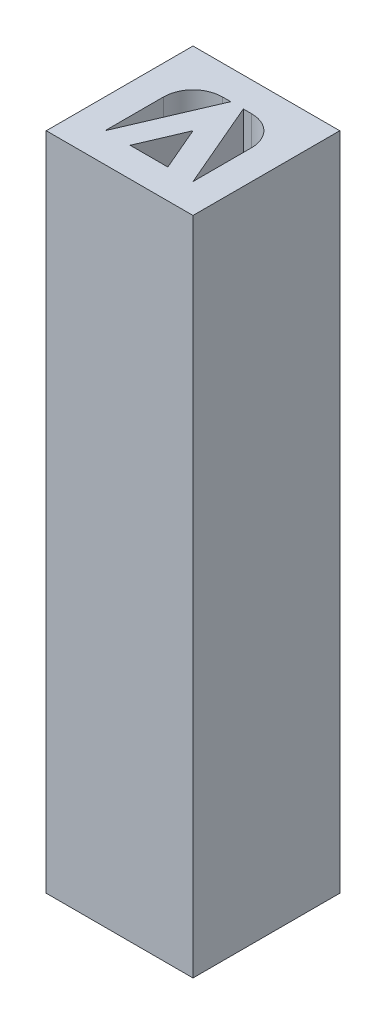
ISO-10303-21;
HEADER;
FILE_DESCRIPTION(('STEP AP214'),'2;1');
FILE_NAME('part.step','',(''),(''),'','','');
FILE_SCHEMA(('AUTOMOTIVE_DESIGN { 1 0 10303 214 1 1 1 1 }'));
ENDSEC;
DATA;
#1=APPLICATION_CONTEXT('core data for automotive mechanical design processes');
#2=APPLICATION_PROTOCOL_DEFINITION('international standard','automotive_design',2000,#1);
#3=PRODUCT_CONTEXT('',#1,'mechanical');
#4=PRODUCT('Part','Part','',(#3));
#5=PRODUCT_RELATED_PRODUCT_CATEGORY('part','',(#4));
#6=PRODUCT_DEFINITION_FORMATION('','',#4);
#7=PRODUCT_DEFINITION_CONTEXT('part definition',#1,'design');
#8=PRODUCT_DEFINITION('design','',#6,#7);
#9=PRODUCT_DEFINITION_SHAPE('','',#8);
#10=(LENGTH_UNIT() NAMED_UNIT(*) SI_UNIT(.MILLI.,.METRE.));
#11=(NAMED_UNIT(*) PLANE_ANGLE_UNIT() SI_UNIT($,.RADIAN.));
#12=(NAMED_UNIT(*) SI_UNIT($,.STERADIAN.) SOLID_ANGLE_UNIT());
#13=UNCERTAINTY_MEASURE_WITH_UNIT(LENGTH_MEASURE(1.E-05),#10,'distance_accuracy_value','');
#14=(GEOMETRIC_REPRESENTATION_CONTEXT(3) GLOBAL_UNCERTAINTY_ASSIGNED_CONTEXT((#13)) GLOBAL_UNIT_ASSIGNED_CONTEXT((#10,
#11,#12)) REPRESENTATION_CONTEXT('',''));
#15=CARTESIAN_POINT('',(0.,0.,0.));
#16=DIRECTION('',(0.,0.,1.));
#17=DIRECTION('',(1.,0.,0.));
#18=AXIS2_PLACEMENT_3D('',#15,#16,#17);
#19=CARTESIAN_POINT('',(2.,45.,-8.));
#20=DIRECTION('',(0.,0.,1.));
#21=DIRECTION('',(1.,0.,0.));
#22=AXIS2_PLACEMENT_3D('',#19,#20,#21);
#23=PLANE('',#22);
#24=DIRECTION('',(-1.,0.,0.));
#25=VECTOR('',#24,1.);
#26=CARTESIAN_POINT('',(2.,0.,-8.));
#27=LINE('',#26,#25);
#28=CARTESIAN_POINT('',(6.,0.,-8.));
#29=VERTEX_POINT('',#28);
#30=CARTESIAN_POINT('',(5.42857142857143,0.,-8.));
#31=VERTEX_POINT('',#30);
#32=EDGE_CURVE('E200',#29,#31,#27,.T.);
#33=ORIENTED_EDGE('',*,*,#32,.F.);
#34=DIRECTION('',(0.,-1.,0.));
#35=VECTOR('',#34,1.);
#36=CARTESIAN_POINT('',(6.,45.,-8.));
#37=LINE('',#36,#35);
#38=CARTESIAN_POINT('',(6.,45.,-8.));
#39=VERTEX_POINT('',#38);
#40=EDGE_CURVE('E55',#29,#39,#37,.F.);
#41=ORIENTED_EDGE('',*,*,#40,.T.);
#42=DIRECTION('',(-1.,0.,0.));
#43=VECTOR('',#42,1.);
#44=CARTESIAN_POINT('',(2.,45.,-8.));
#45=LINE('',#44,#43);
#46=CARTESIAN_POINT('',(5.42857142857143,45.,-8.));
#47=VERTEX_POINT('',#46);
#48=EDGE_CURVE('E208',#39,#47,#45,.T.);
#49=ORIENTED_EDGE('',*,*,#48,.T.);
#50=DIRECTION('',(0.,1.,0.));
#51=VECTOR('',#50,1.);
#52=CARTESIAN_POINT('',(5.42857142857143,45.,-8.));
#53=LINE('',#52,#51);
#54=EDGE_CURVE('E277',#31,#47,#53,.T.);
#55=ORIENTED_EDGE('',*,*,#54,.F.);
#56=EDGE_LOOP('',(#33,#41,#49,#55));
#57=FACE_BOUND('',#56,.T.);
#58=ADVANCED_FACE('F39',(#57),#23,.T.);
#59=CARTESIAN_POINT('',(0.,45.,0.));
#60=DIRECTION('',(0.,-1.,0.));
#61=DIRECTION('',(0.,0.,-1.));
#62=AXIS2_PLACEMENT_3D('',#59,#60,#61);
#63=PLANE('',#62);
#64=DIRECTION('',(0.393919298579168,0.,0.919145030018058));
#65=VECTOR('',#64,1.);
#66=CARTESIAN_POINT('',(8.,45.,-2.));
#67=LINE('',#66,#65);
#68=CARTESIAN_POINT('',(8.,45.,-2.));
#69=VERTEX_POINT('',#68);
#70=EDGE_CURVE('E181',#47,#69,#67,.T.);
#71=ORIENTED_EDGE('',*,*,#70,.F.);
#72=ORIENTED_EDGE('',*,*,#48,.F.);
#73=CARTESIAN_POINT('',(6.,45.,-6.));
#74=DIRECTION('',(0.,-1.,0.));
#75=DIRECTION('',(0.,0.,-1.));
#76=AXIS2_PLACEMENT_3D('',#73,#74,#75);
#77=CIRCLE('',#76,2.);
#78=CARTESIAN_POINT('',(8.,45.,-6.));
#79=VERTEX_POINT('',#78);
#80=EDGE_CURVE('E11',#39,#79,#77,.T.);
#81=ORIENTED_EDGE('',*,*,#80,.T.);
#82=DIRECTION('',(0.,0.,-1.));
#83=VECTOR('',#82,1.);
#84=CARTESIAN_POINT('',(8.,45.,-8.));
#85=LINE('',#84,#83);
#86=EDGE_CURVE('E203',#69,#79,#85,.T.);
#87=ORIENTED_EDGE('',*,*,#86,.F.);
#88=EDGE_LOOP('',(#71,#72,#81,#87));
#89=FACE_BOUND('',#88,.T.);
#90=DIRECTION('',(-0.393919298579167,0.,-0.919145030018058));
#91=VECTOR('',#90,1.);
#92=CARTESIAN_POINT('',(6.28571428571428,45.,-2.));
#93=LINE('',#92,#91);
#94=CARTESIAN_POINT('',(6.28571428571428,45.,-2.));
#95=VERTEX_POINT('',#94);
#96=CARTESIAN_POINT('',(5.,45.,-5.));
#97=VERTEX_POINT('',#96);
#98=EDGE_CURVE('E164',#95,#97,#93,.T.);
#99=ORIENTED_EDGE('',*,*,#98,.F.);
#100=DIRECTION('',(1.,0.,0.));
#101=VECTOR('',#100,1.);
#102=CARTESIAN_POINT('',(2.,45.,-2.));
#103=LINE('',#102,#101);
#104=CARTESIAN_POINT('',(3.71428571428571,45.,-2.));
#105=VERTEX_POINT('',#104);
#106=EDGE_CURVE('E165',#105,#95,#103,.T.);
#107=ORIENTED_EDGE('',*,*,#106,.F.);
#108=DIRECTION('',(-0.393919298579168,0.,0.919145030018058));
#109=VECTOR('',#108,1.);
#110=CARTESIAN_POINT('',(5.,45.,-5.));
#111=LINE('',#110,#109);
#112=EDGE_CURVE('E148',#97,#105,#111,.T.);
#113=ORIENTED_EDGE('',*,*,#112,.F.);
#114=EDGE_LOOP('',(#99,#107,#113));
#115=FACE_BOUND('',#114,.T.);
#116=DIRECTION('',(0.,0.,1.));
#117=VECTOR('',#116,1.);
#118=CARTESIAN_POINT('',(0.,45.,0.));
#119=LINE('',#118,#117);
#120=CARTESIAN_POINT('',(0.,45.,-10.));
#121=VERTEX_POINT('',#120);
#122=CARTESIAN_POINT('',(0.,45.,0.));
#123=VERTEX_POINT('',#122);
#124=EDGE_CURVE('E232',#121,#123,#119,.T.);
#125=ORIENTED_EDGE('',*,*,#124,.T.);
#126=DIRECTION('',(1.,0.,0.));
#127=VECTOR('',#126,1.);
#128=CARTESIAN_POINT('',(0.,45.,0.));
#129=LINE('',#128,#127);
#130=CARTESIAN_POINT('',(10.,45.,0.));
#131=VERTEX_POINT('',#130);
#132=EDGE_CURVE('E236',#123,#131,#129,.T.);
#133=ORIENTED_EDGE('',*,*,#132,.T.);
#134=DIRECTION('',(0.,0.,-1.));
#135=VECTOR('',#134,1.);
#136=CARTESIAN_POINT('',(10.,45.,0.));
#137=LINE('',#136,#135);
#138=CARTESIAN_POINT('',(10.,45.,-10.));
#139=VERTEX_POINT('',#138);
#140=EDGE_CURVE('E240',#131,#139,#137,.T.);
#141=ORIENTED_EDGE('',*,*,#140,.T.);
#142=DIRECTION('',(-1.,0.,0.));
#143=VECTOR('',#142,1.);
#144=CARTESIAN_POINT('',(0.,45.,-10.));
#145=LINE('',#144,#143);
#146=EDGE_CURVE('E243',#139,#121,#145,.T.);
#147=ORIENTED_EDGE('',*,*,#146,.T.);
#148=EDGE_LOOP('',(#125,#133,#141,#147));
#149=FACE_BOUND('',#148,.T.);
#150=CARTESIAN_POINT('',(4.57142857142857,45.,-8.));
#151=VERTEX_POINT('',#150);
#152=CARTESIAN_POINT('',(4.,45.,-8.));
#153=VERTEX_POINT('',#152);
#154=EDGE_CURVE('E207',#151,#153,#45,.T.);
#155=ORIENTED_EDGE('',*,*,#154,.F.);
#156=DIRECTION('',(0.393919298579168,0.,-0.919145030018058));
#157=VECTOR('',#156,1.);
#158=CARTESIAN_POINT('',(5.,45.,-9.));
#159=LINE('',#158,#157);
#160=CARTESIAN_POINT('',(2.,45.,-2.));
#161=VERTEX_POINT('',#160);
#162=EDGE_CURVE('E167',#161,#151,#159,.T.);
#163=ORIENTED_EDGE('',*,*,#162,.F.);
#164=DIRECTION('',(0.,0.,1.));
#165=VECTOR('',#164,1.);
#166=CARTESIAN_POINT('',(2.,45.,-8.));
#167=LINE('',#166,#165);
#168=CARTESIAN_POINT('',(2.,45.,-6.));
#169=VERTEX_POINT('',#168);
#170=EDGE_CURVE('E197',#169,#161,#167,.T.);
#171=ORIENTED_EDGE('',*,*,#170,.F.);
#172=CARTESIAN_POINT('',(4.,45.,-6.));
#173=DIRECTION('',(0.,-1.,0.));
#174=DIRECTION('',(0.,0.,-1.));
#175=AXIS2_PLACEMENT_3D('',#172,#173,#174);
#176=CIRCLE('',#175,2.);
#177=EDGE_CURVE('E297',#169,#153,#176,.T.);
#178=ORIENTED_EDGE('',*,*,#177,.T.);
#179=EDGE_LOOP('',(#155,#163,#171,#178));
#180=FACE_BOUND('',#179,.T.);
#181=ADVANCED_FACE('F162',(#89,#115,#149,#180),#63,.F.);
#182=CARTESIAN_POINT('',(0.,0.,0.));
#183=DIRECTION('',(0.,-1.,0.));
#184=DIRECTION('',(0.,0.,-1.));
#185=AXIS2_PLACEMENT_3D('',#182,#183,#184);
#186=PLANE('',#185);
#187=DIRECTION('',(0.,0.,-1.));
#188=VECTOR('',#187,1.);
#189=CARTESIAN_POINT('',(8.,0.,-8.));
#190=LINE('',#189,#188);
#191=CARTESIAN_POINT('',(8.,0.,-2.));
#192=VERTEX_POINT('',#191);
#193=CARTESIAN_POINT('',(8.,0.,-6.));
#194=VERTEX_POINT('',#193);
#195=EDGE_CURVE('E218',#192,#194,#190,.T.);
#196=ORIENTED_EDGE('',*,*,#195,.T.);
#197=CARTESIAN_POINT('',(6.,0.,-6.));
#198=DIRECTION('',(0.,-1.,0.));
#199=DIRECTION('',(0.,0.,-1.));
#200=AXIS2_PLACEMENT_3D('',#197,#198,#199);
#201=CIRCLE('',#200,2.);
#202=EDGE_CURVE('E48',#194,#29,#201,.F.);
#203=ORIENTED_EDGE('',*,*,#202,.T.);
#204=ORIENTED_EDGE('',*,*,#32,.T.);
#205=DIRECTION('',(0.393919298579168,0.,0.919145030018058));
#206=VECTOR('',#205,1.);
#207=CARTESIAN_POINT('',(8.,0.,-2.));
#208=LINE('',#207,#206);
#209=EDGE_CURVE('E172',#31,#192,#208,.T.);
#210=ORIENTED_EDGE('',*,*,#209,.T.);
#211=EDGE_LOOP('',(#196,#203,#204,#210));
#212=FACE_BOUND('',#211,.T.);
#213=DIRECTION('',(1.,0.,0.));
#214=VECTOR('',#213,1.);
#215=CARTESIAN_POINT('',(2.,0.,-2.));
#216=LINE('',#215,#214);
#217=CARTESIAN_POINT('',(3.71428571428571,0.,-2.));
#218=VERTEX_POINT('',#217);
#219=CARTESIAN_POINT('',(6.28571428571428,0.,-2.));
#220=VERTEX_POINT('',#219);
#221=EDGE_CURVE('E214',#218,#220,#216,.T.);
#222=ORIENTED_EDGE('',*,*,#221,.T.);
#223=DIRECTION('',(-0.393919298579167,0.,-0.919145030018058));
#224=VECTOR('',#223,1.);
#225=CARTESIAN_POINT('',(6.28571428571428,0.,-2.));
#226=LINE('',#225,#224);
#227=CARTESIAN_POINT('',(5.,0.,-5.));
#228=VERTEX_POINT('',#227);
#229=EDGE_CURVE('E185',#220,#228,#226,.T.);
#230=ORIENTED_EDGE('',*,*,#229,.T.);
#231=DIRECTION('',(-0.393919298579168,0.,0.919145030018058));
#232=VECTOR('',#231,1.);
#233=CARTESIAN_POINT('',(5.,0.,-5.));
#234=LINE('',#233,#232);
#235=EDGE_CURVE('E150',#228,#218,#234,.T.);
#236=ORIENTED_EDGE('',*,*,#235,.T.);
#237=EDGE_LOOP('',(#222,#230,#236));
#238=FACE_BOUND('',#237,.T.);
#239=DIRECTION('',(0.393919298579168,0.,-0.919145030018058));
#240=VECTOR('',#239,1.);
#241=CARTESIAN_POINT('',(5.,0.,-9.));
#242=LINE('',#241,#240);
#243=CARTESIAN_POINT('',(2.,0.,-2.));
#244=VERTEX_POINT('',#243);
#245=CARTESIAN_POINT('',(4.57142857142857,0.,-8.));
#246=VERTEX_POINT('',#245);
#247=EDGE_CURVE('E176',#244,#246,#242,.T.);
#248=ORIENTED_EDGE('',*,*,#247,.T.);
#249=CARTESIAN_POINT('',(4.,0.,-8.));
#250=VERTEX_POINT('',#249);
#251=EDGE_CURVE('E221',#246,#250,#27,.T.);
#252=ORIENTED_EDGE('',*,*,#251,.T.);
#253=CARTESIAN_POINT('',(4.,0.,-6.));
#254=DIRECTION('',(0.,-1.,0.));
#255=DIRECTION('',(0.,0.,-1.));
#256=AXIS2_PLACEMENT_3D('',#253,#254,#255);
#257=CIRCLE('',#256,2.);
#258=CARTESIAN_POINT('',(2.,0.,-6.));
#259=VERTEX_POINT('',#258);
#260=EDGE_CURVE('E294',#250,#259,#257,.F.);
#261=ORIENTED_EDGE('',*,*,#260,.T.);
#262=DIRECTION('',(0.,0.,1.));
#263=VECTOR('',#262,1.);
#264=CARTESIAN_POINT('',(2.,0.,-8.));
#265=LINE('',#264,#263);
#266=EDGE_CURVE('E193',#259,#244,#265,.T.);
#267=ORIENTED_EDGE('',*,*,#266,.T.);
#268=EDGE_LOOP('',(#248,#252,#261,#267));
#269=FACE_BOUND('',#268,.T.);
#270=DIRECTION('',(0.,0.,1.));
#271=VECTOR('',#270,1.);
#272=CARTESIAN_POINT('',(0.,0.,0.));
#273=LINE('',#272,#271);
#274=CARTESIAN_POINT('',(0.,0.,-10.));
#275=VERTEX_POINT('',#274);
#276=CARTESIAN_POINT('',(0.,0.,0.));
#277=VERTEX_POINT('',#276);
#278=EDGE_CURVE('E231',#275,#277,#273,.T.);
#279=ORIENTED_EDGE('',*,*,#278,.F.);
#280=DIRECTION('',(-1.,0.,0.));
#281=VECTOR('',#280,1.);
#282=CARTESIAN_POINT('',(0.,0.,-10.));
#283=LINE('',#282,#281);
#284=CARTESIAN_POINT('',(10.,0.,-10.));
#285=VERTEX_POINT('',#284);
#286=EDGE_CURVE('E237',#285,#275,#283,.T.);
#287=ORIENTED_EDGE('',*,*,#286,.F.);
#288=DIRECTION('',(0.,0.,-1.));
#289=VECTOR('',#288,1.);
#290=CARTESIAN_POINT('',(10.,0.,0.));
#291=LINE('',#290,#289);
#292=CARTESIAN_POINT('',(10.,0.,0.));
#293=VERTEX_POINT('',#292);
#294=EDGE_CURVE('E253',#293,#285,#291,.T.);
#295=ORIENTED_EDGE('',*,*,#294,.F.);
#296=DIRECTION('',(1.,0.,0.));
#297=VECTOR('',#296,1.);
#298=CARTESIAN_POINT('',(0.,0.,0.));
#299=LINE('',#298,#297);
#300=EDGE_CURVE('E250',#277,#293,#299,.T.);
#301=ORIENTED_EDGE('',*,*,#300,.F.);
#302=EDGE_LOOP('',(#279,#287,#295,#301));
#303=FACE_BOUND('',#302,.T.);
#304=ADVANCED_FACE('F306',(#212,#238,#269,#303),#186,.T.);
#305=CARTESIAN_POINT('',(0.,45.,0.));
#306=DIRECTION('',(1.,0.,0.));
#307=DIRECTION('',(0.,0.,-1.));
#308=AXIS2_PLACEMENT_3D('',#305,#306,#307);
#309=PLANE('',#308);
#310=ORIENTED_EDGE('',*,*,#278,.T.);
#311=DIRECTION('',(0.,-1.,0.));
#312=VECTOR('',#311,1.);
#313=CARTESIAN_POINT('',(0.,45.,0.));
#314=LINE('',#313,#312);
#315=EDGE_CURVE('E269',#123,#277,#314,.T.);
#316=ORIENTED_EDGE('',*,*,#315,.F.);
#317=ORIENTED_EDGE('',*,*,#124,.F.);
#318=DIRECTION('',(0.,-1.,0.));
#319=VECTOR('',#318,1.);
#320=CARTESIAN_POINT('',(0.,45.,-10.));
#321=LINE('',#320,#319);
#322=EDGE_CURVE('E246',#121,#275,#321,.T.);
#323=ORIENTED_EDGE('',*,*,#322,.T.);
#324=EDGE_LOOP('',(#310,#316,#317,#323));
#325=FACE_BOUND('',#324,.T.);
#326=ADVANCED_FACE('F364',(#325),#309,.F.);
#327=CARTESIAN_POINT('',(0.,45.,0.));
#328=DIRECTION('',(0.,0.,-1.));
#329=DIRECTION('',(-1.,0.,0.));
#330=AXIS2_PLACEMENT_3D('',#327,#328,#329);
#331=PLANE('',#330);
#332=ORIENTED_EDGE('',*,*,#300,.T.);
#333=DIRECTION('',(0.,-1.,0.));
#334=VECTOR('',#333,1.);
#335=CARTESIAN_POINT('',(10.,45.,0.));
#336=LINE('',#335,#334);
#337=EDGE_CURVE('E265',#131,#293,#336,.T.);
#338=ORIENTED_EDGE('',*,*,#337,.F.);
#339=ORIENTED_EDGE('',*,*,#132,.F.);
#340=ORIENTED_EDGE('',*,*,#315,.T.);
#341=EDGE_LOOP('',(#332,#338,#339,#340));
#342=FACE_BOUND('',#341,.T.);
#343=ADVANCED_FACE('F371',(#342),#331,.F.);
#344=CARTESIAN_POINT('',(10.,45.,0.));
#345=DIRECTION('',(-1.,0.,0.));
#346=DIRECTION('',(0.,0.,1.));
#347=AXIS2_PLACEMENT_3D('',#344,#345,#346);
#348=PLANE('',#347);
#349=ORIENTED_EDGE('',*,*,#294,.T.);
#350=DIRECTION('',(0.,-1.,0.));
#351=VECTOR('',#350,1.);
#352=CARTESIAN_POINT('',(10.,45.,-10.));
#353=LINE('',#352,#351);
#354=EDGE_CURVE('E261',#139,#285,#353,.T.);
#355=ORIENTED_EDGE('',*,*,#354,.F.);
#356=ORIENTED_EDGE('',*,*,#140,.F.);
#357=ORIENTED_EDGE('',*,*,#337,.T.);
#358=EDGE_LOOP('',(#349,#355,#356,#357));
#359=FACE_BOUND('',#358,.T.);
#360=ADVANCED_FACE('F367',(#359),#348,.F.);
#361=CARTESIAN_POINT('',(0.,45.,-10.));
#362=DIRECTION('',(0.,0.,1.));
#363=DIRECTION('',(1.,0.,0.));
#364=AXIS2_PLACEMENT_3D('',#361,#362,#363);
#365=PLANE('',#364);
#366=ORIENTED_EDGE('',*,*,#286,.T.);
#367=ORIENTED_EDGE('',*,*,#322,.F.);
#368=ORIENTED_EDGE('',*,*,#146,.F.);
#369=ORIENTED_EDGE('',*,*,#354,.T.);
#370=EDGE_LOOP('',(#366,#367,#368,#369));
#371=FACE_BOUND('',#370,.T.);
#372=ADVANCED_FACE('F360',(#371),#365,.F.);
#373=CARTESIAN_POINT('',(2.,45.,-8.));
#374=DIRECTION('',(1.,0.,0.));
#375=DIRECTION('',(0.,0.,-1.));
#376=AXIS2_PLACEMENT_3D('',#373,#374,#375);
#377=PLANE('',#376);
#378=ORIENTED_EDGE('',*,*,#266,.F.);
#379=DIRECTION('',(0.,-1.,0.));
#380=VECTOR('',#379,1.);
#381=CARTESIAN_POINT('',(2.,45.,-6.));
#382=LINE('',#381,#380);
#383=EDGE_CURVE('E285',#259,#169,#382,.F.);
#384=ORIENTED_EDGE('',*,*,#383,.T.);
#385=ORIENTED_EDGE('',*,*,#170,.T.);
#386=DIRECTION('',(0.,-1.,0.));
#387=VECTOR('',#386,1.);
#388=CARTESIAN_POINT('',(2.,45.,-2.));
#389=LINE('',#388,#387);
#390=EDGE_CURVE('E227',#161,#244,#389,.T.);
#391=ORIENTED_EDGE('',*,*,#390,.T.);
#392=EDGE_LOOP('',(#378,#384,#385,#391));
#393=FACE_BOUND('',#392,.T.);
#394=ADVANCED_FACE('F321',(#393),#377,.T.);
#395=CARTESIAN_POINT('',(2.,45.,-2.));
#396=DIRECTION('',(0.,0.,-1.));
#397=DIRECTION('',(-1.,0.,0.));
#398=AXIS2_PLACEMENT_3D('',#395,#396,#397);
#399=PLANE('',#398);
#400=DIRECTION('',(0.,-1.,0.));
#401=VECTOR('',#400,1.);
#402=CARTESIAN_POINT('',(3.71428571428571,45.,-2.));
#403=LINE('',#402,#401);
#404=EDGE_CURVE('E156',#105,#218,#403,.T.);
#405=ORIENTED_EDGE('',*,*,#404,.F.);
#406=ORIENTED_EDGE('',*,*,#106,.T.);
#407=DIRECTION('',(0.,-1.,0.));
#408=VECTOR('',#407,1.);
#409=CARTESIAN_POINT('',(6.28571428571428,45.,-2.));
#410=LINE('',#409,#408);
#411=EDGE_CURVE('E157',#95,#220,#410,.T.);
#412=ORIENTED_EDGE('',*,*,#411,.T.);
#413=ORIENTED_EDGE('',*,*,#221,.F.);
#414=EDGE_LOOP('',(#405,#406,#412,#413));
#415=FACE_BOUND('',#414,.T.);
#416=ADVANCED_FACE('F351',(#415),#399,.T.);
#417=CARTESIAN_POINT('',(8.,45.,-8.));
#418=DIRECTION('',(-1.,0.,0.));
#419=DIRECTION('',(0.,0.,1.));
#420=AXIS2_PLACEMENT_3D('',#417,#418,#419);
#421=PLANE('',#420);
#422=ORIENTED_EDGE('',*,*,#86,.T.);
#423=DIRECTION('',(0.,-1.,0.));
#424=VECTOR('',#423,1.);
#425=CARTESIAN_POINT('',(8.,0.,-6.));
#426=LINE('',#425,#424);
#427=EDGE_CURVE('E288',#79,#194,#426,.T.);
#428=ORIENTED_EDGE('',*,*,#427,.T.);
#429=ORIENTED_EDGE('',*,*,#195,.F.);
#430=DIRECTION('',(0.,-1.,0.));
#431=VECTOR('',#430,1.);
#432=CARTESIAN_POINT('',(8.,45.,-2.));
#433=LINE('',#432,#431);
#434=EDGE_CURVE('E211',#69,#192,#433,.T.);
#435=ORIENTED_EDGE('',*,*,#434,.F.);
#436=EDGE_LOOP('',(#422,#428,#429,#435));
#437=FACE_BOUND('',#436,.T.);
#438=ADVANCED_FACE('F347',(#437),#421,.T.);
#439=ORIENTED_EDGE('',*,*,#154,.T.);
#440=DIRECTION('',(0.,-1.,0.));
#441=VECTOR('',#440,1.);
#442=CARTESIAN_POINT('',(4.,0.,-8.));
#443=LINE('',#442,#441);
#444=EDGE_CURVE('E281',#153,#250,#443,.T.);
#445=ORIENTED_EDGE('',*,*,#444,.T.);
#446=ORIENTED_EDGE('',*,*,#251,.F.);
#447=DIRECTION('',(0.,-1.,0.));
#448=VECTOR('',#447,1.);
#449=CARTESIAN_POINT('',(4.57142857142857,45.,-8.));
#450=LINE('',#449,#448);
#451=EDGE_CURVE('E273',#151,#246,#450,.T.);
#452=ORIENTED_EDGE('',*,*,#451,.F.);
#453=EDGE_LOOP('',(#439,#445,#446,#452));
#454=FACE_BOUND('',#453,.T.);
#455=ADVANCED_FACE('F312',(#454),#23,.T.);
#456=CARTESIAN_POINT('',(8.,45.,-2.));
#457=DIRECTION('',(0.919145030018058,0.,-0.393919298579168));
#458=DIRECTION('',(-0.393919298579168,0.,-0.919145030018058));
#459=AXIS2_PLACEMENT_3D('',#456,#457,#458);
#460=PLANE('',#459);
#461=ORIENTED_EDGE('',*,*,#209,.F.);
#462=ORIENTED_EDGE('',*,*,#54,.T.);
#463=ORIENTED_EDGE('',*,*,#70,.T.);
#464=ORIENTED_EDGE('',*,*,#434,.T.);
#465=EDGE_LOOP('',(#461,#462,#463,#464));
#466=FACE_BOUND('',#465,.T.);
#467=ADVANCED_FACE('F328',(#466),#460,.T.);
#468=CARTESIAN_POINT('',(5.,45.,-9.));
#469=DIRECTION('',(-0.919145030018058,0.,-0.393919298579168));
#470=DIRECTION('',(-0.393919298579168,0.,0.919145030018058));
#471=AXIS2_PLACEMENT_3D('',#468,#469,#470);
#472=PLANE('',#471);
#473=ORIENTED_EDGE('',*,*,#162,.T.);
#474=ORIENTED_EDGE('',*,*,#451,.T.);
#475=ORIENTED_EDGE('',*,*,#247,.F.);
#476=ORIENTED_EDGE('',*,*,#390,.F.);
#477=EDGE_LOOP('',(#473,#474,#475,#476));
#478=FACE_BOUND('',#477,.T.);
#479=ADVANCED_FACE('F326',(#478),#472,.T.);
#480=CARTESIAN_POINT('',(5.,45.,-5.));
#481=DIRECTION('',(0.919145030018058,0.,0.393919298579167));
#482=DIRECTION('',(0.393919298579168,0.,-0.919145030018058));
#483=AXIS2_PLACEMENT_3D('',#480,#481,#482);
#484=PLANE('',#483);
#485=ORIENTED_EDGE('',*,*,#235,.F.);
#486=DIRECTION('',(0.,-1.,0.));
#487=VECTOR('',#486,1.);
#488=CARTESIAN_POINT('',(5.,45.,-5.));
#489=LINE('',#488,#487);
#490=EDGE_CURVE('E144',#97,#228,#489,.T.);
#491=ORIENTED_EDGE('',*,*,#490,.F.);
#492=ORIENTED_EDGE('',*,*,#112,.T.);
#493=ORIENTED_EDGE('',*,*,#404,.T.);
#494=EDGE_LOOP('',(#485,#491,#492,#493));
#495=FACE_BOUND('',#494,.T.);
#496=ADVANCED_FACE('F146',(#495),#484,.T.);
#497=CARTESIAN_POINT('',(6.28571428571428,45.,-2.));
#498=DIRECTION('',(-0.919145030018058,0.,0.393919298579167));
#499=DIRECTION('',(0.393919298579167,0.,0.919145030018058));
#500=AXIS2_PLACEMENT_3D('',#497,#498,#499);
#501=PLANE('',#500);
#502=ORIENTED_EDGE('',*,*,#229,.F.);
#503=ORIENTED_EDGE('',*,*,#411,.F.);
#504=ORIENTED_EDGE('',*,*,#98,.T.);
#505=ORIENTED_EDGE('',*,*,#490,.T.);
#506=EDGE_LOOP('',(#502,#503,#504,#505));
#507=FACE_BOUND('',#506,.T.);
#508=ADVANCED_FACE('F170',(#507),#501,.T.);
#509=CARTESIAN_POINT('',(4.,45.,-6.));
#510=DIRECTION('',(0.,1.,0.));
#511=DIRECTION('',(0.,0.,1.));
#512=AXIS2_PLACEMENT_3D('',#509,#510,#511);
#513=CYLINDRICAL_SURFACE('',#512,2.);
#514=ORIENTED_EDGE('',*,*,#177,.F.);
#515=ORIENTED_EDGE('',*,*,#383,.F.);
#516=ORIENTED_EDGE('',*,*,#260,.F.);
#517=ORIENTED_EDGE('',*,*,#444,.F.);
#518=EDGE_LOOP('',(#514,#515,#516,#517));
#519=FACE_BOUND('',#518,.T.);
#520=ADVANCED_FACE('F317',(#519),#513,.F.);
#521=CARTESIAN_POINT('',(6.,45.,-6.));
#522=DIRECTION('',(0.,1.,0.));
#523=DIRECTION('',(0.,0.,1.));
#524=AXIS2_PLACEMENT_3D('',#521,#522,#523);
#525=CYLINDRICAL_SURFACE('',#524,2.);
#526=ORIENTED_EDGE('',*,*,#80,.F.);
#527=ORIENTED_EDGE('',*,*,#40,.F.);
#528=ORIENTED_EDGE('',*,*,#202,.F.);
#529=ORIENTED_EDGE('',*,*,#427,.F.);
#530=EDGE_LOOP('',(#526,#527,#528,#529));
#531=FACE_BOUND('',#530,.T.);
#532=ADVANCED_FACE('F41',(#531),#525,.F.);
#533=CLOSED_SHELL('',(#58,#181,#304,#326,#343,#360,#372,#394,#416,#438,#455,#467,#479,#496,#508,
#520,#532));
#534=MANIFOLD_SOLID_BREP('B2',#533);
#535=ADVANCED_BREP_SHAPE_REPRESENTATION('',(#18,#534),#14);
#536=SHAPE_DEFINITION_REPRESENTATION(#9,#535);
ENDSEC;
END-ISO-10303-21;
